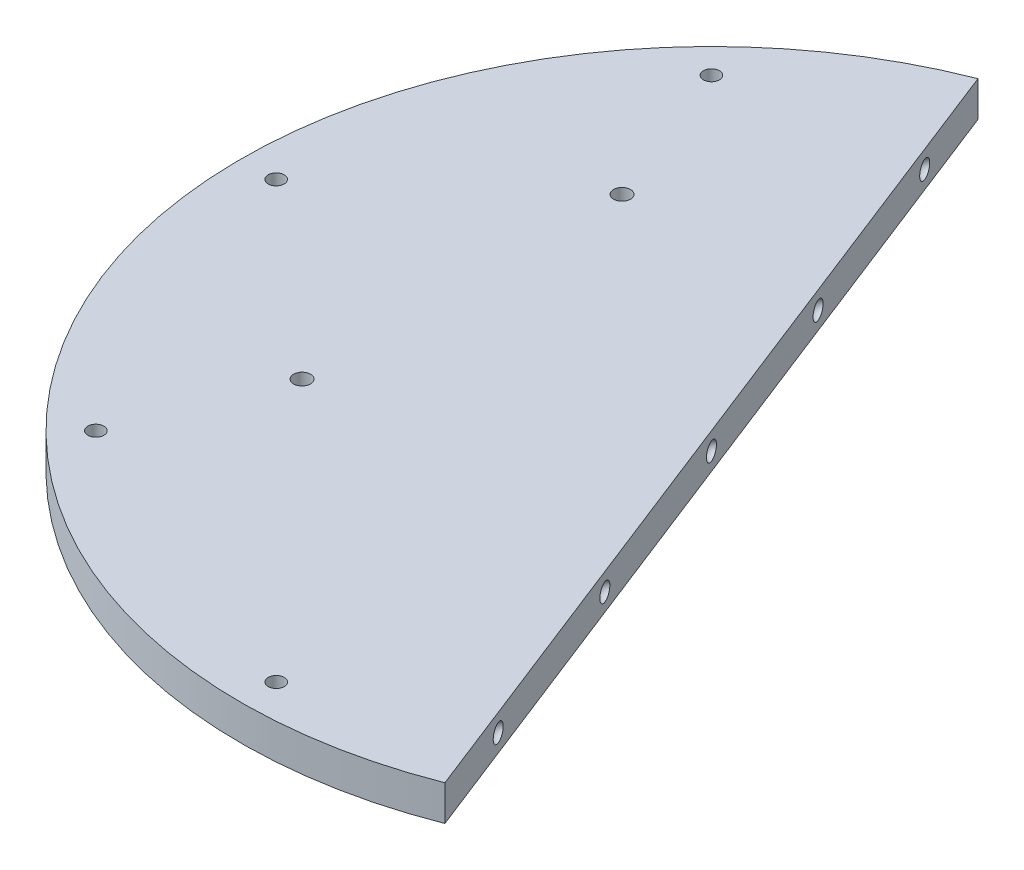
ISO-10303-21;
HEADER;
FILE_DESCRIPTION(('STEP AP214'),'2;1');
FILE_NAME('part.step','',(''),(''),'','','');
FILE_SCHEMA(('AUTOMOTIVE_DESIGN { 1 0 10303 214 1 1 1 1 }'));
ENDSEC;
DATA;
#1=APPLICATION_CONTEXT('core data for automotive mechanical design processes');
#2=APPLICATION_PROTOCOL_DEFINITION('international standard','automotive_design',2000,#1);
#3=PRODUCT_CONTEXT('',#1,'mechanical');
#4=PRODUCT('Part','Part','',(#3));
#5=PRODUCT_RELATED_PRODUCT_CATEGORY('part','',(#4));
#6=PRODUCT_DEFINITION_FORMATION('','',#4);
#7=PRODUCT_DEFINITION_CONTEXT('part definition',#1,'design');
#8=PRODUCT_DEFINITION('design','',#6,#7);
#9=PRODUCT_DEFINITION_SHAPE('','',#8);
#10=(LENGTH_UNIT() NAMED_UNIT(*) SI_UNIT(.MILLI.,.METRE.));
#11=(NAMED_UNIT(*) PLANE_ANGLE_UNIT() SI_UNIT($,.RADIAN.));
#12=(NAMED_UNIT(*) SI_UNIT($,.STERADIAN.) SOLID_ANGLE_UNIT());
#13=UNCERTAINTY_MEASURE_WITH_UNIT(LENGTH_MEASURE(1.E-05),#10,'distance_accuracy_value','');
#14=(GEOMETRIC_REPRESENTATION_CONTEXT(3) GLOBAL_UNCERTAINTY_ASSIGNED_CONTEXT((#13)) GLOBAL_UNIT_ASSIGNED_CONTEXT((#10,
#11,#12)) REPRESENTATION_CONTEXT('',''));
#15=CARTESIAN_POINT('',(0.,0.,0.));
#16=DIRECTION('',(0.,0.,1.));
#17=DIRECTION('',(1.,0.,0.));
#18=AXIS2_PLACEMENT_3D('',#15,#16,#17);
#19=CARTESIAN_POINT('',(0.,0.,0.));
#20=DIRECTION('',(0.,1.,0.));
#21=DIRECTION('',(0.,0.,1.));
#22=AXIS2_PLACEMENT_3D('',#19,#20,#21);
#23=PLANE('',#22);
#24=CARTESIAN_POINT('',(-53.,0.,-34.));
#25=DIRECTION('',(0.,-1.,0.));
#26=DIRECTION('',(0.,0.,-1.));
#27=AXIS2_PLACEMENT_3D('',#24,#25,#26);
#28=CIRCLE('',#27,3.25);
#29=CARTESIAN_POINT('',(-53.,0.,-37.25));
#30=VERTEX_POINT('',#29);
#31=EDGE_CURVE('E142',#30,#30,#28,.T.);
#32=ORIENTED_EDGE('',*,*,#31,.F.);
#33=EDGE_LOOP('',(#32));
#34=FACE_BOUND('',#33,.T.);
#35=CARTESIAN_POINT('',(-53.,0.,34.));
#36=DIRECTION('',(0.,-1.,0.));
#37=DIRECTION('',(0.,0.,-1.));
#38=AXIS2_PLACEMENT_3D('',#35,#36,#37);
#39=CIRCLE('',#38,3.25);
#40=CARTESIAN_POINT('',(-53.,0.,30.75));
#41=VERTEX_POINT('',#40);
#42=EDGE_CURVE('E130',#41,#41,#39,.T.);
#43=ORIENTED_EDGE('',*,*,#42,.F.);
#44=EDGE_LOOP('',(#43));
#45=FACE_BOUND('',#44,.T.);
#46=CARTESIAN_POINT('',(0.,0.,92.5));
#47=DIRECTION('',(0.,-1.,0.));
#48=DIRECTION('',(0.,0.,-1.));
#49=AXIS2_PLACEMENT_3D('',#46,#47,#48);
#50=CIRCLE('',#49,3.25);
#51=CARTESIAN_POINT('',(0.,0.,89.25));
#52=VERTEX_POINT('',#51);
#53=EDGE_CURVE('E118',#52,#52,#50,.T.);
#54=ORIENTED_EDGE('',*,*,#53,.F.);
#55=EDGE_LOOP('',(#54));
#56=FACE_BOUND('',#55,.T.);
#57=CARTESIAN_POINT('',(-65.4073772597562,0.,-65.4073772597551));
#58=DIRECTION('',(0.,-1.,0.));
#59=DIRECTION('',(0.,0.,-1.));
#60=AXIS2_PLACEMENT_3D('',#57,#58,#59);
#61=CIRCLE('',#60,3.25);
#62=CARTESIAN_POINT('',(-65.4073772597562,0.,-68.6573772597551));
#63=VERTEX_POINT('',#62);
#64=EDGE_CURVE('E106',#63,#63,#61,.T.);
#65=ORIENTED_EDGE('',*,*,#64,.F.);
#66=EDGE_LOOP('',(#65));
#67=FACE_BOUND('',#66,.T.);
#68=CARTESIAN_POINT('',(-92.5,0.,9.67967586429609E-13));
#69=DIRECTION('',(0.,-1.,0.));
#70=DIRECTION('',(0.,0.,-1.));
#71=AXIS2_PLACEMENT_3D('',#68,#69,#70);
#72=CIRCLE('',#71,3.25);
#73=CARTESIAN_POINT('',(-92.5,0.,-3.24999999999903));
#74=VERTEX_POINT('',#73);
#75=EDGE_CURVE('E94',#74,#74,#72,.T.);
#76=ORIENTED_EDGE('',*,*,#75,.F.);
#77=EDGE_LOOP('',(#76));
#78=FACE_BOUND('',#77,.T.);
#79=CARTESIAN_POINT('',(-65.4073772597548,0.,65.4073772597564));
#80=DIRECTION('',(0.,-1.,0.));
#81=DIRECTION('',(0.,0.,-1.));
#82=AXIS2_PLACEMENT_3D('',#79,#80,#81);
#83=CIRCLE('',#82,3.25);
#84=CARTESIAN_POINT('',(-65.4073772597548,0.,62.1573772597564));
#85=VERTEX_POINT('',#84);
#86=EDGE_CURVE('E82',#85,#85,#83,.T.);
#87=ORIENTED_EDGE('',*,*,#86,.F.);
#88=EDGE_LOOP('',(#87));
#89=FACE_BOUND('',#88,.T.);
#90=CARTESIAN_POINT('',(0.,0.,0.));
#91=DIRECTION('',(0.,1.,0.));
#92=DIRECTION('',(0.,0.,1.));
#93=AXIS2_PLACEMENT_3D('',#90,#91,#92);
#94=CIRCLE('',#93,100.);
#95=CARTESIAN_POINT('',(-36.4698084371753,0.,-93.1125827831864));
#96=VERTEX_POINT('',#95);
#97=CARTESIAN_POINT('',(36.4698084371753,0.,93.1125827831864));
#98=VERTEX_POINT('',#97);
#99=EDGE_CURVE('E66',#96,#98,#94,.T.);
#100=ORIENTED_EDGE('',*,*,#99,.F.);
#101=DIRECTION('',(0.364698084371753,0.,0.931125827831864));
#102=VECTOR('',#101,1.);
#103=CARTESIAN_POINT('',(0.,0.,0.));
#104=LINE('',#103,#102);
#105=EDGE_CURVE('E52',#96,#98,#104,.T.);
#106=ORIENTED_EDGE('',*,*,#105,.T.);
#107=EDGE_LOOP('',(#100,#106));
#108=FACE_BOUND('',#107,.T.);
#109=ADVANCED_FACE('F33',(#34,#45,#56,#67,#78,#89,#108),#23,.F.);
#110=CARTESIAN_POINT('',(0.,7.5,0.));
#111=DIRECTION('',(0.,-1.,0.));
#112=DIRECTION('',(0.,0.,-1.));
#113=AXIS2_PLACEMENT_3D('',#110,#111,#112);
#114=CYLINDRICAL_SURFACE('',#113,100.);
#115=CARTESIAN_POINT('',(0.,7.5,0.));
#116=DIRECTION('',(0.,1.,0.));
#117=DIRECTION('',(0.,0.,1.));
#118=AXIS2_PLACEMENT_3D('',#115,#116,#117);
#119=CIRCLE('',#118,100.);
#120=CARTESIAN_POINT('',(-36.4698084371753,7.5,-93.1125827831864));
#121=VERTEX_POINT('',#120);
#122=CARTESIAN_POINT('',(36.4698084371753,7.5,93.1125827831864));
#123=VERTEX_POINT('',#122);
#124=EDGE_CURVE('E41',#121,#123,#119,.T.);
#125=ORIENTED_EDGE('',*,*,#124,.F.);
#126=DIRECTION('',(0.,-1.,0.));
#127=VECTOR('',#126,1.);
#128=CARTESIAN_POINT('',(-36.4698084371753,7.5,-93.1125827831864));
#129=LINE('',#128,#127);
#130=EDGE_CURVE('E47',#121,#96,#129,.T.);
#131=ORIENTED_EDGE('',*,*,#130,.T.);
#132=ORIENTED_EDGE('',*,*,#99,.T.);
#133=DIRECTION('',(0.,-1.,0.));
#134=VECTOR('',#133,1.);
#135=CARTESIAN_POINT('',(36.4698084371753,7.5,93.1125827831864));
#136=LINE('',#135,#134);
#137=EDGE_CURVE('E58',#98,#123,#136,.F.);
#138=ORIENTED_EDGE('',*,*,#137,.T.);
#139=EDGE_LOOP('',(#125,#131,#132,#138));
#140=FACE_BOUND('',#139,.T.);
#141=ADVANCED_FACE('F64',(#140),#114,.T.);
#142=CARTESIAN_POINT('',(0.,7.5,0.));
#143=DIRECTION('',(0.,1.,0.));
#144=DIRECTION('',(0.,0.,1.));
#145=AXIS2_PLACEMENT_3D('',#142,#143,#144);
#146=PLANE('',#145);
#147=DIRECTION('',(0.364698084371753,0.,0.931125827831864));
#148=VECTOR('',#147,1.);
#149=CARTESIAN_POINT('',(0.,7.5,0.));
#150=LINE('',#149,#148);
#151=EDGE_CURVE('E11',#121,#123,#150,.T.);
#152=ORIENTED_EDGE('',*,*,#151,.F.);
#153=ORIENTED_EDGE('',*,*,#124,.T.);
#154=EDGE_LOOP('',(#152,#153));
#155=FACE_BOUND('',#154,.T.);
#156=CARTESIAN_POINT('',(-53.,7.5,-34.));
#157=DIRECTION('',(0.,-1.,0.));
#158=DIRECTION('',(0.,0.,-1.));
#159=AXIS2_PLACEMENT_3D('',#156,#157,#158);
#160=CIRCLE('',#159,1.8);
#161=CARTESIAN_POINT('',(-53.,7.5,-35.8));
#162=VERTEX_POINT('',#161);
#163=EDGE_CURVE('E133',#162,#162,#160,.T.);
#164=ORIENTED_EDGE('',*,*,#163,.T.);
#165=EDGE_LOOP('',(#164));
#166=FACE_BOUND('',#165,.T.);
#167=CARTESIAN_POINT('',(-53.,7.5,34.));
#168=DIRECTION('',(0.,-1.,0.));
#169=DIRECTION('',(0.,0.,-1.));
#170=AXIS2_PLACEMENT_3D('',#167,#168,#169);
#171=CIRCLE('',#170,1.8);
#172=CARTESIAN_POINT('',(-53.,7.5,32.2));
#173=VERTEX_POINT('',#172);
#174=EDGE_CURVE('E121',#173,#173,#171,.T.);
#175=ORIENTED_EDGE('',*,*,#174,.T.);
#176=EDGE_LOOP('',(#175));
#177=FACE_BOUND('',#176,.T.);
#178=CARTESIAN_POINT('',(0.,7.5,92.5));
#179=DIRECTION('',(0.,-1.,0.));
#180=DIRECTION('',(0.,0.,-1.));
#181=AXIS2_PLACEMENT_3D('',#178,#179,#180);
#182=CIRCLE('',#181,1.7);
#183=CARTESIAN_POINT('',(0.,7.5,90.8));
#184=VERTEX_POINT('',#183);
#185=EDGE_CURVE('E109',#184,#184,#182,.T.);
#186=ORIENTED_EDGE('',*,*,#185,.T.);
#187=EDGE_LOOP('',(#186));
#188=FACE_BOUND('',#187,.T.);
#189=CARTESIAN_POINT('',(-65.4073772597562,7.5,-65.4073772597551));
#190=DIRECTION('',(0.,-1.,0.));
#191=DIRECTION('',(0.,0.,-1.));
#192=AXIS2_PLACEMENT_3D('',#189,#190,#191);
#193=CIRCLE('',#192,1.69999999999999);
#194=CARTESIAN_POINT('',(-65.4073772597562,7.5,-67.1073772597551));
#195=VERTEX_POINT('',#194);
#196=EDGE_CURVE('E97',#195,#195,#193,.T.);
#197=ORIENTED_EDGE('',*,*,#196,.T.);
#198=EDGE_LOOP('',(#197));
#199=FACE_BOUND('',#198,.T.);
#200=CARTESIAN_POINT('',(-92.5,7.5,9.67967586429609E-13));
#201=DIRECTION('',(0.,-1.,0.));
#202=DIRECTION('',(0.,0.,-1.));
#203=AXIS2_PLACEMENT_3D('',#200,#201,#202);
#204=CIRCLE('',#203,1.69999999999999);
#205=CARTESIAN_POINT('',(-92.5,7.5,-1.69999999999903));
#206=VERTEX_POINT('',#205);
#207=EDGE_CURVE('E85',#206,#206,#204,.T.);
#208=ORIENTED_EDGE('',*,*,#207,.T.);
#209=EDGE_LOOP('',(#208));
#210=FACE_BOUND('',#209,.T.);
#211=CARTESIAN_POINT('',(-65.4073772597548,7.5,65.4073772597564));
#212=DIRECTION('',(0.,-1.,0.));
#213=DIRECTION('',(0.,0.,-1.));
#214=AXIS2_PLACEMENT_3D('',#211,#212,#213);
#215=CIRCLE('',#214,1.69999999999999);
#216=CARTESIAN_POINT('',(-65.4073772597548,7.5,63.7073772597564));
#217=VERTEX_POINT('',#216);
#218=EDGE_CURVE('E72',#217,#217,#215,.T.);
#219=ORIENTED_EDGE('',*,*,#218,.T.);
#220=EDGE_LOOP('',(#219));
#221=FACE_BOUND('',#220,.T.);
#222=ADVANCED_FACE('F69',(#155,#166,#177,#188,#199,#210,#221),#146,.T.);
#223=CARTESIAN_POINT('',(-65.4073772597548,0.,65.4073772597564));
#224=DIRECTION('',(0.,-1.,0.));
#225=DIRECTION('',(0.,0.,-1.));
#226=AXIS2_PLACEMENT_3D('',#223,#224,#225);
#227=CYLINDRICAL_SURFACE('',#226,1.69999999999999);
#228=ORIENTED_EDGE('',*,*,#218,.F.);
#229=EDGE_LOOP('',(#228));
#230=FACE_BOUND('',#229,.T.);
#231=CARTESIAN_POINT('',(-65.4073772597548,3.,65.4073772597564));
#232=DIRECTION('',(0.,-1.,0.));
#233=DIRECTION('',(0.,0.,-1.));
#234=AXIS2_PLACEMENT_3D('',#231,#232,#233);
#235=CIRCLE('',#234,1.69999999999999);
#236=CARTESIAN_POINT('',(-65.4073772597548,3.,63.7073772597564));
#237=VERTEX_POINT('',#236);
#238=EDGE_CURVE('E76',#237,#237,#235,.T.);
#239=ORIENTED_EDGE('',*,*,#238,.T.);
#240=EDGE_LOOP('',(#239));
#241=FACE_BOUND('',#240,.T.);
#242=ADVANCED_FACE('F191',(#230,#241),#227,.F.);
#243=CARTESIAN_POINT('',(-63.7073772597548,3.,65.4073772597564));
#244=DIRECTION('',(0.,1.,0.));
#245=DIRECTION('',(0.,0.,1.));
#246=AXIS2_PLACEMENT_3D('',#243,#244,#245);
#247=PLANE('',#246);
#248=ORIENTED_EDGE('',*,*,#238,.F.);
#249=EDGE_LOOP('',(#248));
#250=FACE_BOUND('',#249,.T.);
#251=CARTESIAN_POINT('',(-65.4073772597548,3.,65.4073772597564));
#252=DIRECTION('',(0.,-1.,0.));
#253=DIRECTION('',(0.,0.,-1.));
#254=AXIS2_PLACEMENT_3D('',#251,#252,#253);
#255=CIRCLE('',#254,3.25);
#256=CARTESIAN_POINT('',(-65.4073772597548,3.,62.1573772597564));
#257=VERTEX_POINT('',#256);
#258=EDGE_CURVE('E79',#257,#257,#255,.T.);
#259=ORIENTED_EDGE('',*,*,#258,.T.);
#260=EDGE_LOOP('',(#259));
#261=FACE_BOUND('',#260,.T.);
#262=ADVANCED_FACE('F194',(#250,#261),#247,.F.);
#263=CARTESIAN_POINT('',(-65.4073772597548,0.,65.4073772597564));
#264=DIRECTION('',(0.,-1.,0.));
#265=DIRECTION('',(0.,0.,-1.));
#266=AXIS2_PLACEMENT_3D('',#263,#264,#265);
#267=CYLINDRICAL_SURFACE('',#266,3.25);
#268=ORIENTED_EDGE('',*,*,#258,.F.);
#269=EDGE_LOOP('',(#268));
#270=FACE_BOUND('',#269,.T.);
#271=ORIENTED_EDGE('',*,*,#86,.T.);
#272=EDGE_LOOP('',(#271));
#273=FACE_BOUND('',#272,.T.);
#274=ADVANCED_FACE('F198',(#270,#273),#267,.F.);
#275=CARTESIAN_POINT('',(-92.5,0.,9.67967586429609E-13));
#276=DIRECTION('',(0.,-1.,0.));
#277=DIRECTION('',(0.,0.,-1.));
#278=AXIS2_PLACEMENT_3D('',#275,#276,#277);
#279=CYLINDRICAL_SURFACE('',#278,1.69999999999999);
#280=ORIENTED_EDGE('',*,*,#207,.F.);
#281=EDGE_LOOP('',(#280));
#282=FACE_BOUND('',#281,.T.);
#283=CARTESIAN_POINT('',(-92.5,3.,9.67967586429609E-13));
#284=DIRECTION('',(0.,-1.,0.));
#285=DIRECTION('',(0.,0.,-1.));
#286=AXIS2_PLACEMENT_3D('',#283,#284,#285);
#287=CIRCLE('',#286,1.69999999999999);
#288=CARTESIAN_POINT('',(-92.5,3.,-1.69999999999903));
#289=VERTEX_POINT('',#288);
#290=EDGE_CURVE('E88',#289,#289,#287,.T.);
#291=ORIENTED_EDGE('',*,*,#290,.T.);
#292=EDGE_LOOP('',(#291));
#293=FACE_BOUND('',#292,.T.);
#294=ADVANCED_FACE('F202',(#282,#293),#279,.F.);
#295=CARTESIAN_POINT('',(-90.8,3.,9.67967586429609E-13));
#296=DIRECTION('',(0.,1.,0.));
#297=DIRECTION('',(0.,0.,1.));
#298=AXIS2_PLACEMENT_3D('',#295,#296,#297);
#299=PLANE('',#298);
#300=ORIENTED_EDGE('',*,*,#290,.F.);
#301=EDGE_LOOP('',(#300));
#302=FACE_BOUND('',#301,.T.);
#303=CARTESIAN_POINT('',(-92.5,3.,9.67967586429609E-13));
#304=DIRECTION('',(0.,-1.,0.));
#305=DIRECTION('',(0.,0.,-1.));
#306=AXIS2_PLACEMENT_3D('',#303,#304,#305);
#307=CIRCLE('',#306,3.25);
#308=CARTESIAN_POINT('',(-92.5,3.,-3.24999999999903));
#309=VERTEX_POINT('',#308);
#310=EDGE_CURVE('E91',#309,#309,#307,.T.);
#311=ORIENTED_EDGE('',*,*,#310,.T.);
#312=EDGE_LOOP('',(#311));
#313=FACE_BOUND('',#312,.T.);
#314=ADVANCED_FACE('F206',(#302,#313),#299,.F.);
#315=CARTESIAN_POINT('',(-92.5,0.,9.67967586429609E-13));
#316=DIRECTION('',(0.,-1.,0.));
#317=DIRECTION('',(0.,0.,-1.));
#318=AXIS2_PLACEMENT_3D('',#315,#316,#317);
#319=CYLINDRICAL_SURFACE('',#318,3.25);
#320=ORIENTED_EDGE('',*,*,#310,.F.);
#321=EDGE_LOOP('',(#320));
#322=FACE_BOUND('',#321,.T.);
#323=ORIENTED_EDGE('',*,*,#75,.T.);
#324=EDGE_LOOP('',(#323));
#325=FACE_BOUND('',#324,.T.);
#326=ADVANCED_FACE('F210',(#322,#325),#319,.F.);
#327=CARTESIAN_POINT('',(-65.4073772597562,0.,-65.4073772597551));
#328=DIRECTION('',(0.,-1.,0.));
#329=DIRECTION('',(0.,0.,-1.));
#330=AXIS2_PLACEMENT_3D('',#327,#328,#329);
#331=CYLINDRICAL_SURFACE('',#330,1.69999999999999);
#332=ORIENTED_EDGE('',*,*,#196,.F.);
#333=EDGE_LOOP('',(#332));
#334=FACE_BOUND('',#333,.T.);
#335=CARTESIAN_POINT('',(-65.4073772597562,3.,-65.4073772597551));
#336=DIRECTION('',(0.,-1.,0.));
#337=DIRECTION('',(0.,0.,-1.));
#338=AXIS2_PLACEMENT_3D('',#335,#336,#337);
#339=CIRCLE('',#338,1.69999999999999);
#340=CARTESIAN_POINT('',(-65.4073772597562,3.,-67.1073772597551));
#341=VERTEX_POINT('',#340);
#342=EDGE_CURVE('E100',#341,#341,#339,.T.);
#343=ORIENTED_EDGE('',*,*,#342,.T.);
#344=EDGE_LOOP('',(#343));
#345=FACE_BOUND('',#344,.T.);
#346=ADVANCED_FACE('F214',(#334,#345),#331,.F.);
#347=CARTESIAN_POINT('',(-63.7073772597563,3.,-65.4073772597551));
#348=DIRECTION('',(0.,1.,0.));
#349=DIRECTION('',(0.,0.,1.));
#350=AXIS2_PLACEMENT_3D('',#347,#348,#349);
#351=PLANE('',#350);
#352=ORIENTED_EDGE('',*,*,#342,.F.);
#353=EDGE_LOOP('',(#352));
#354=FACE_BOUND('',#353,.T.);
#355=CARTESIAN_POINT('',(-65.4073772597562,3.,-65.4073772597551));
#356=DIRECTION('',(0.,-1.,0.));
#357=DIRECTION('',(0.,0.,-1.));
#358=AXIS2_PLACEMENT_3D('',#355,#356,#357);
#359=CIRCLE('',#358,3.25);
#360=CARTESIAN_POINT('',(-65.4073772597562,3.,-68.6573772597551));
#361=VERTEX_POINT('',#360);
#362=EDGE_CURVE('E103',#361,#361,#359,.T.);
#363=ORIENTED_EDGE('',*,*,#362,.T.);
#364=EDGE_LOOP('',(#363));
#365=FACE_BOUND('',#364,.T.);
#366=ADVANCED_FACE('F218',(#354,#365),#351,.F.);
#367=CARTESIAN_POINT('',(-65.4073772597562,0.,-65.4073772597551));
#368=DIRECTION('',(0.,-1.,0.));
#369=DIRECTION('',(0.,0.,-1.));
#370=AXIS2_PLACEMENT_3D('',#367,#368,#369);
#371=CYLINDRICAL_SURFACE('',#370,3.25);
#372=ORIENTED_EDGE('',*,*,#362,.F.);
#373=EDGE_LOOP('',(#372));
#374=FACE_BOUND('',#373,.T.);
#375=ORIENTED_EDGE('',*,*,#64,.T.);
#376=EDGE_LOOP('',(#375));
#377=FACE_BOUND('',#376,.T.);
#378=ADVANCED_FACE('F222',(#374,#377),#371,.F.);
#379=CARTESIAN_POINT('',(0.,0.,92.5));
#380=DIRECTION('',(0.,-1.,0.));
#381=DIRECTION('',(0.,0.,-1.));
#382=AXIS2_PLACEMENT_3D('',#379,#380,#381);
#383=CYLINDRICAL_SURFACE('',#382,1.7);
#384=ORIENTED_EDGE('',*,*,#185,.F.);
#385=EDGE_LOOP('',(#384));
#386=FACE_BOUND('',#385,.T.);
#387=CARTESIAN_POINT('',(0.,3.,92.5));
#388=DIRECTION('',(0.,-1.,0.));
#389=DIRECTION('',(0.,0.,-1.));
#390=AXIS2_PLACEMENT_3D('',#387,#388,#389);
#391=CIRCLE('',#390,1.7);
#392=CARTESIAN_POINT('',(0.,3.,90.8));
#393=VERTEX_POINT('',#392);
#394=EDGE_CURVE('E112',#393,#393,#391,.T.);
#395=ORIENTED_EDGE('',*,*,#394,.T.);
#396=EDGE_LOOP('',(#395));
#397=FACE_BOUND('',#396,.T.);
#398=ADVANCED_FACE('F226',(#386,#397),#383,.F.);
#399=CARTESIAN_POINT('',(1.7,3.,92.5));
#400=DIRECTION('',(0.,1.,0.));
#401=DIRECTION('',(0.,0.,1.));
#402=AXIS2_PLACEMENT_3D('',#399,#400,#401);
#403=PLANE('',#402);
#404=ORIENTED_EDGE('',*,*,#394,.F.);
#405=EDGE_LOOP('',(#404));
#406=FACE_BOUND('',#405,.T.);
#407=CARTESIAN_POINT('',(0.,3.,92.5));
#408=DIRECTION('',(0.,-1.,0.));
#409=DIRECTION('',(0.,0.,-1.));
#410=AXIS2_PLACEMENT_3D('',#407,#408,#409);
#411=CIRCLE('',#410,3.25);
#412=CARTESIAN_POINT('',(0.,3.,89.25));
#413=VERTEX_POINT('',#412);
#414=EDGE_CURVE('E115',#413,#413,#411,.T.);
#415=ORIENTED_EDGE('',*,*,#414,.T.);
#416=EDGE_LOOP('',(#415));
#417=FACE_BOUND('',#416,.T.);
#418=ADVANCED_FACE('F230',(#406,#417),#403,.F.);
#419=CARTESIAN_POINT('',(0.,0.,92.5));
#420=DIRECTION('',(0.,-1.,0.));
#421=DIRECTION('',(0.,0.,-1.));
#422=AXIS2_PLACEMENT_3D('',#419,#420,#421);
#423=CYLINDRICAL_SURFACE('',#422,3.25);
#424=ORIENTED_EDGE('',*,*,#414,.F.);
#425=EDGE_LOOP('',(#424));
#426=FACE_BOUND('',#425,.T.);
#427=ORIENTED_EDGE('',*,*,#53,.T.);
#428=EDGE_LOOP('',(#427));
#429=FACE_BOUND('',#428,.T.);
#430=ADVANCED_FACE('F234',(#426,#429),#423,.F.);
#431=CARTESIAN_POINT('',(-53.,0.,34.));
#432=DIRECTION('',(0.,-1.,0.));
#433=DIRECTION('',(0.,0.,-1.));
#434=AXIS2_PLACEMENT_3D('',#431,#432,#433);
#435=CYLINDRICAL_SURFACE('',#434,1.8);
#436=ORIENTED_EDGE('',*,*,#174,.F.);
#437=EDGE_LOOP('',(#436));
#438=FACE_BOUND('',#437,.T.);
#439=CARTESIAN_POINT('',(-53.,3.,34.));
#440=DIRECTION('',(0.,-1.,0.));
#441=DIRECTION('',(0.,0.,-1.));
#442=AXIS2_PLACEMENT_3D('',#439,#440,#441);
#443=CIRCLE('',#442,1.8);
#444=CARTESIAN_POINT('',(-53.,3.,32.2));
#445=VERTEX_POINT('',#444);
#446=EDGE_CURVE('E124',#445,#445,#443,.T.);
#447=ORIENTED_EDGE('',*,*,#446,.T.);
#448=EDGE_LOOP('',(#447));
#449=FACE_BOUND('',#448,.T.);
#450=ADVANCED_FACE('F238',(#438,#449),#435,.F.);
#451=CARTESIAN_POINT('',(-51.2,3.,34.));
#452=DIRECTION('',(0.,1.,0.));
#453=DIRECTION('',(0.,0.,1.));
#454=AXIS2_PLACEMENT_3D('',#451,#452,#453);
#455=PLANE('',#454);
#456=ORIENTED_EDGE('',*,*,#446,.F.);
#457=EDGE_LOOP('',(#456));
#458=FACE_BOUND('',#457,.T.);
#459=CARTESIAN_POINT('',(-53.,3.,34.));
#460=DIRECTION('',(0.,-1.,0.));
#461=DIRECTION('',(0.,0.,-1.));
#462=AXIS2_PLACEMENT_3D('',#459,#460,#461);
#463=CIRCLE('',#462,3.25);
#464=CARTESIAN_POINT('',(-53.,3.,30.75));
#465=VERTEX_POINT('',#464);
#466=EDGE_CURVE('E127',#465,#465,#463,.T.);
#467=ORIENTED_EDGE('',*,*,#466,.T.);
#468=EDGE_LOOP('',(#467));
#469=FACE_BOUND('',#468,.T.);
#470=ADVANCED_FACE('F242',(#458,#469),#455,.F.);
#471=CARTESIAN_POINT('',(-53.,0.,34.));
#472=DIRECTION('',(0.,-1.,0.));
#473=DIRECTION('',(0.,0.,-1.));
#474=AXIS2_PLACEMENT_3D('',#471,#472,#473);
#475=CYLINDRICAL_SURFACE('',#474,3.25);
#476=ORIENTED_EDGE('',*,*,#466,.F.);
#477=EDGE_LOOP('',(#476));
#478=FACE_BOUND('',#477,.T.);
#479=ORIENTED_EDGE('',*,*,#42,.T.);
#480=EDGE_LOOP('',(#479));
#481=FACE_BOUND('',#480,.T.);
#482=ADVANCED_FACE('F246',(#478,#481),#475,.F.);
#483=CARTESIAN_POINT('',(-53.,0.,-34.));
#484=DIRECTION('',(0.,-1.,0.));
#485=DIRECTION('',(0.,0.,-1.));
#486=AXIS2_PLACEMENT_3D('',#483,#484,#485);
#487=CYLINDRICAL_SURFACE('',#486,1.8);
#488=ORIENTED_EDGE('',*,*,#163,.F.);
#489=EDGE_LOOP('',(#488));
#490=FACE_BOUND('',#489,.T.);
#491=CARTESIAN_POINT('',(-53.,3.,-34.));
#492=DIRECTION('',(0.,-1.,0.));
#493=DIRECTION('',(0.,0.,-1.));
#494=AXIS2_PLACEMENT_3D('',#491,#492,#493);
#495=CIRCLE('',#494,1.8);
#496=CARTESIAN_POINT('',(-53.,3.,-35.8));
#497=VERTEX_POINT('',#496);
#498=EDGE_CURVE('E136',#497,#497,#495,.T.);
#499=ORIENTED_EDGE('',*,*,#498,.T.);
#500=EDGE_LOOP('',(#499));
#501=FACE_BOUND('',#500,.T.);
#502=ADVANCED_FACE('F250',(#490,#501),#487,.F.);
#503=CARTESIAN_POINT('',(-51.2,3.,-34.));
#504=DIRECTION('',(0.,1.,0.));
#505=DIRECTION('',(0.,0.,1.));
#506=AXIS2_PLACEMENT_3D('',#503,#504,#505);
#507=PLANE('',#506);
#508=ORIENTED_EDGE('',*,*,#498,.F.);
#509=EDGE_LOOP('',(#508));
#510=FACE_BOUND('',#509,.T.);
#511=CARTESIAN_POINT('',(-53.,3.,-34.));
#512=DIRECTION('',(0.,-1.,0.));
#513=DIRECTION('',(0.,0.,-1.));
#514=AXIS2_PLACEMENT_3D('',#511,#512,#513);
#515=CIRCLE('',#514,3.25);
#516=CARTESIAN_POINT('',(-53.,3.,-37.25));
#517=VERTEX_POINT('',#516);
#518=EDGE_CURVE('E139',#517,#517,#515,.T.);
#519=ORIENTED_EDGE('',*,*,#518,.T.);
#520=EDGE_LOOP('',(#519));
#521=FACE_BOUND('',#520,.T.);
#522=ADVANCED_FACE('F254',(#510,#521),#507,.F.);
#523=CARTESIAN_POINT('',(-53.,0.,-34.));
#524=DIRECTION('',(0.,-1.,0.));
#525=DIRECTION('',(0.,0.,-1.));
#526=AXIS2_PLACEMENT_3D('',#523,#524,#525);
#527=CYLINDRICAL_SURFACE('',#526,3.25);
#528=ORIENTED_EDGE('',*,*,#518,.F.);
#529=EDGE_LOOP('',(#528));
#530=FACE_BOUND('',#529,.T.);
#531=ORIENTED_EDGE('',*,*,#31,.T.);
#532=EDGE_LOOP('',(#531));
#533=FACE_BOUND('',#532,.T.);
#534=ADVANCED_FACE('F258',(#530,#533),#527,.F.);
#535=CARTESIAN_POINT('',(0.,0.,0.));
#536=DIRECTION('',(-0.931125827831864,0.,0.364698084371753));
#537=DIRECTION('',(0.364698084371753,0.,0.931125827831864));
#538=AXIS2_PLACEMENT_3D('',#535,#536,#537);
#539=PLANE('',#538);
#540=CARTESIAN_POINT('',(-14.5879233748701,3.74999999999972,-37.2450331132745));
#541=DIRECTION('',(-0.931125827831864,0.,0.364698084371753));
#542=DIRECTION('',(0.364698084371753,0.,0.931125827831864));
#543=AXIS2_PLACEMENT_3D('',#540,#541,#542);
#544=CIRCLE('',#543,1.87499999999999);
#545=CARTESIAN_POINT('',(-13.9041144666731,3.74999999999972,-35.4991721860898));
#546=VERTEX_POINT('',#545);
#547=EDGE_CURVE('E149',#546,#546,#544,.T.);
#548=ORIENTED_EDGE('',*,*,#547,.T.);
#549=EDGE_LOOP('',(#548));
#550=FACE_BOUND('',#549,.T.);
#551=CARTESIAN_POINT('',(-29.1758467497403,3.74999999999944,-74.4900662265491));
#552=DIRECTION('',(-0.931125827831864,0.,0.364698084371753));
#553=DIRECTION('',(0.364698084371753,0.,0.931125827831864));
#554=AXIS2_PLACEMENT_3D('',#551,#552,#553);
#555=CIRCLE('',#554,1.875);
#556=CARTESIAN_POINT('',(-28.4920378415432,3.74999999999944,-72.7442052993643));
#557=VERTEX_POINT('',#556);
#558=EDGE_CURVE('E156',#557,#557,#555,.T.);
#559=ORIENTED_EDGE('',*,*,#558,.T.);
#560=EDGE_LOOP('',(#559));
#561=FACE_BOUND('',#560,.T.);
#562=CARTESIAN_POINT('',(29.1758467497403,3.74999999999944,74.4900662265491));
#563=DIRECTION('',(-0.931125827831864,0.,0.364698084371753));
#564=DIRECTION('',(-0.364698084371753,0.,-0.931125827831864));
#565=AXIS2_PLACEMENT_3D('',#562,#563,#564);
#566=CIRCLE('',#565,1.875);
#567=CARTESIAN_POINT('',(28.4920378415432,3.74999999999944,72.7442052993643));
#568=VERTEX_POINT('',#567);
#569=EDGE_CURVE('E153',#568,#568,#566,.T.);
#570=ORIENTED_EDGE('',*,*,#569,.T.);
#571=EDGE_LOOP('',(#570));
#572=FACE_BOUND('',#571,.T.);
#573=CARTESIAN_POINT('',(14.5879233748701,3.74999999999972,37.2450331132745));
#574=DIRECTION('',(-0.931125827831864,0.,0.364698084371753));
#575=DIRECTION('',(-0.364698084371753,0.,-0.931125827831864));
#576=AXIS2_PLACEMENT_3D('',#573,#574,#575);
#577=CIRCLE('',#576,1.87499999999999);
#578=CARTESIAN_POINT('',(13.9041144666731,3.74999999999972,35.4991721860898));
#579=VERTEX_POINT('',#578);
#580=EDGE_CURVE('E150',#579,#579,#577,.T.);
#581=ORIENTED_EDGE('',*,*,#580,.T.);
#582=EDGE_LOOP('',(#581));
#583=FACE_BOUND('',#582,.T.);
#584=CARTESIAN_POINT('',(0.,3.75,0.));
#585=DIRECTION('',(-0.931125827831864,0.,0.364698084371753));
#586=DIRECTION('',(0.364698084371753,0.,0.931125827831864));
#587=AXIS2_PLACEMENT_3D('',#584,#585,#586);
#588=CIRCLE('',#587,1.875);
#589=CARTESIAN_POINT('',(0.683808908197037,3.75,1.74586092718474));
#590=VERTEX_POINT('',#589);
#591=EDGE_CURVE('E67',#590,#590,#588,.T.);
#592=ORIENTED_EDGE('',*,*,#591,.T.);
#593=EDGE_LOOP('',(#592));
#594=FACE_BOUND('',#593,.T.);
#595=ORIENTED_EDGE('',*,*,#130,.F.);
#596=ORIENTED_EDGE('',*,*,#151,.T.);
#597=ORIENTED_EDGE('',*,*,#137,.F.);
#598=ORIENTED_EDGE('',*,*,#105,.F.);
#599=EDGE_LOOP('',(#595,#596,#597,#598));
#600=FACE_BOUND('',#599,.T.);
#601=ADVANCED_FACE('F57',(#550,#561,#572,#583,#594,#600),#539,.F.);
#602=CARTESIAN_POINT('',(-29.1758467497403,3.74999999999944,-74.4900662265491));
#603=DIRECTION('',(-0.931125827831864,0.,0.364698084371753));
#604=DIRECTION('',(0.364698084371753,0.,0.931125827831864));
#605=AXIS2_PLACEMENT_3D('',#602,#603,#604);
#606=SPHERICAL_SURFACE('',#605,1.875);
#607=ORIENTED_EDGE('',*,*,#558,.F.);
#608=EDGE_LOOP('',(#607));
#609=FACE_BOUND('',#608,.T.);
#610=ADVANCED_FACE('F167',(#609),#606,.F.);
#611=CARTESIAN_POINT('',(-14.5879233748701,3.74999999999972,-37.2450331132745));
#612=DIRECTION('',(-0.931125827831864,0.,0.364698084371753));
#613=DIRECTION('',(0.364698084371753,0.,0.931125827831864));
#614=AXIS2_PLACEMENT_3D('',#611,#612,#613);
#615=SPHERICAL_SURFACE('',#614,1.875);
#616=ORIENTED_EDGE('',*,*,#547,.F.);
#617=EDGE_LOOP('',(#616));
#618=FACE_BOUND('',#617,.T.);
#619=ADVANCED_FACE('F164',(#618),#615,.F.);
#620=CARTESIAN_POINT('',(29.1758467497403,3.74999999999944,74.4900662265491));
#621=DIRECTION('',(0.931125827831864,0.,-0.364698084371753));
#622=DIRECTION('',(-0.364698084371753,0.,-0.931125827831864));
#623=AXIS2_PLACEMENT_3D('',#620,#621,#622);
#624=SPHERICAL_SURFACE('',#623,1.875);
#625=ORIENTED_EDGE('',*,*,#569,.F.);
#626=EDGE_LOOP('',(#625));
#627=FACE_BOUND('',#626,.T.);
#628=ADVANCED_FACE('F166',(#627),#624,.F.);
#629=CARTESIAN_POINT('',(14.5879233748701,3.74999999999972,37.2450331132745));
#630=DIRECTION('',(0.931125827831864,0.,-0.364698084371753));
#631=DIRECTION('',(-0.364698084371753,0.,-0.931125827831864));
#632=AXIS2_PLACEMENT_3D('',#629,#630,#631);
#633=SPHERICAL_SURFACE('',#632,1.875);
#634=ORIENTED_EDGE('',*,*,#580,.F.);
#635=EDGE_LOOP('',(#634));
#636=FACE_BOUND('',#635,.T.);
#637=ADVANCED_FACE('F173',(#636),#633,.F.);
#638=CARTESIAN_POINT('',(0.,3.75,0.));
#639=DIRECTION('',(-0.931125827831864,0.,0.364698084371753));
#640=DIRECTION('',(0.364698084371753,0.,0.931125827831864));
#641=AXIS2_PLACEMENT_3D('',#638,#639,#640);
#642=SPHERICAL_SURFACE('',#641,1.875);
#643=ORIENTED_EDGE('',*,*,#591,.F.);
#644=EDGE_LOOP('',(#643));
#645=FACE_BOUND('',#644,.T.);
#646=ADVANCED_FACE('F35',(#645),#642,.F.);
#647=CLOSED_SHELL('',(#109,#141,#222,#242,#262,#274,#294,#314,#326,#346,#366,#378,#398,#418,
#430,#450,#470,#482,#502,#522,#534,#601,#610,#619,#628,#637,#646));
#648=MANIFOLD_SOLID_BREP('B2',#647);
#649=ADVANCED_BREP_SHAPE_REPRESENTATION('',(#18,#648),#14);
#650=SHAPE_DEFINITION_REPRESENTATION(#9,#649);
ENDSEC;
END-ISO-10303-21;
